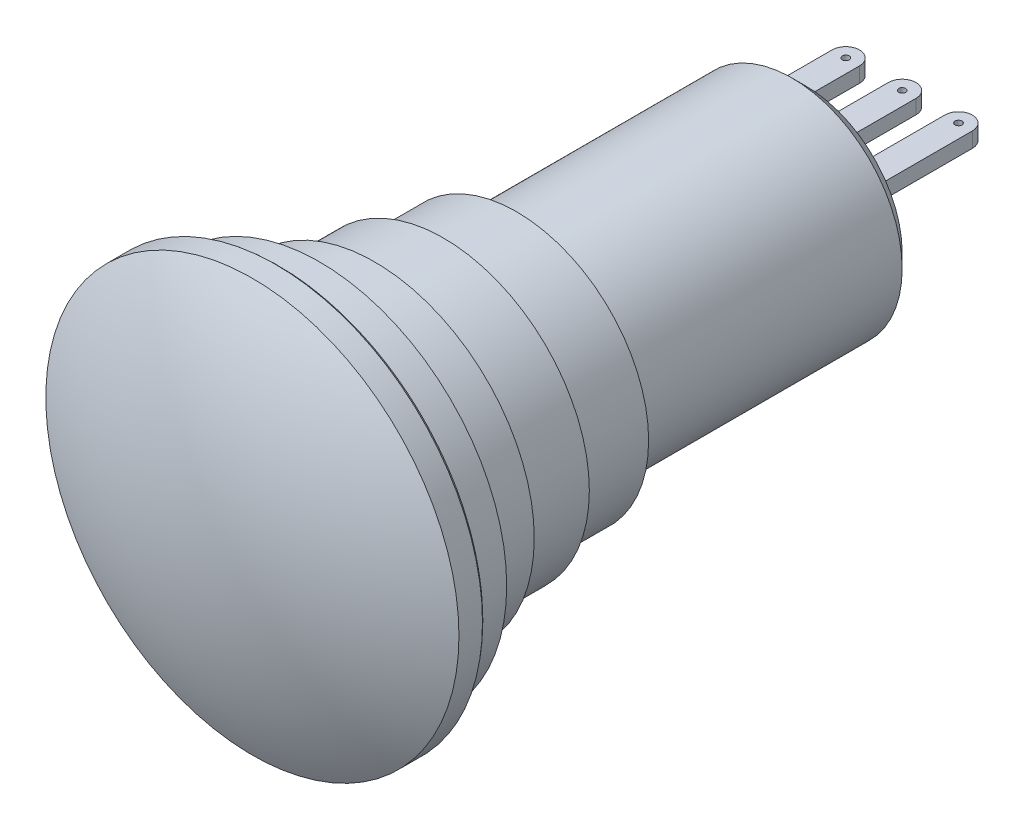
ISO-10303-21;
HEADER;
FILE_DESCRIPTION(('STEP AP214'),'2;1');
FILE_NAME('part.step','',(''),(''),'','','');
FILE_SCHEMA(('AUTOMOTIVE_DESIGN { 1 0 10303 214 1 1 1 1 }'));
ENDSEC;
DATA;
#1=APPLICATION_CONTEXT('core data for automotive mechanical design processes');
#2=APPLICATION_PROTOCOL_DEFINITION('international standard','automotive_design',2000,#1);
#3=PRODUCT_CONTEXT('',#1,'mechanical');
#4=PRODUCT('Part','Part','',(#3));
#5=PRODUCT_RELATED_PRODUCT_CATEGORY('part','',(#4));
#6=PRODUCT_DEFINITION_FORMATION('','',#4);
#7=PRODUCT_DEFINITION_CONTEXT('part definition',#1,'design');
#8=PRODUCT_DEFINITION('design','',#6,#7);
#9=PRODUCT_DEFINITION_SHAPE('','',#8);
#10=(LENGTH_UNIT() NAMED_UNIT(*) SI_UNIT(.MILLI.,.METRE.));
#11=(NAMED_UNIT(*) PLANE_ANGLE_UNIT() SI_UNIT($,.RADIAN.));
#12=(NAMED_UNIT(*) SI_UNIT($,.STERADIAN.) SOLID_ANGLE_UNIT());
#13=UNCERTAINTY_MEASURE_WITH_UNIT(LENGTH_MEASURE(1.E-05),#10,'distance_accuracy_value','');
#14=(GEOMETRIC_REPRESENTATION_CONTEXT(3) GLOBAL_UNCERTAINTY_ASSIGNED_CONTEXT((#13)) GLOBAL_UNIT_ASSIGNED_CONTEXT((#10,
#11,#12)) REPRESENTATION_CONTEXT('',''));
#15=CARTESIAN_POINT('',(0.,0.,0.));
#16=DIRECTION('',(0.,0.,1.));
#17=DIRECTION('',(1.,0.,0.));
#18=AXIS2_PLACEMENT_3D('',#15,#16,#17);
#19=CARTESIAN_POINT('',(0.,5.18367058079445,-39.5));
#20=DIRECTION('',(0.,-1.,0.));
#21=DIRECTION('',(1.,0.,0.));
#22=AXIS2_PLACEMENT_3D('',#19,#20,#21);
#23=CYLINDRICAL_SURFACE('',#22,0.25);
#24=CARTESIAN_POINT('',(0.,3.21505442393994,-39.5));
#25=DIRECTION('',(0.,1.,0.));
#26=DIRECTION('',(-1.,0.,0.));
#27=AXIS2_PLACEMENT_3D('',#24,#25,#26);
#28=CIRCLE('',#27,0.25);
#29=CARTESIAN_POINT('',(-0.24999999999999,3.21505442393994,-39.5));
#30=VERTEX_POINT('',#29);
#31=EDGE_CURVE('E352',#30,#30,#28,.F.);
#32=ORIENTED_EDGE('',*,*,#31,.F.);
#33=EDGE_LOOP('',(#32));
#34=FACE_BOUND('',#33,.T.);
#35=CARTESIAN_POINT('',(0.,2.17665175285374,-39.5));
#36=DIRECTION('',(0.,-1.,0.));
#37=DIRECTION('',(1.,0.,0.));
#38=AXIS2_PLACEMENT_3D('',#35,#36,#37);
#39=CIRCLE('',#38,0.25);
#40=CARTESIAN_POINT('',(0.25000000000001,2.17665175285374,-39.5));
#41=VERTEX_POINT('',#40);
#42=EDGE_CURVE('E11',#41,#41,#39,.T.);
#43=ORIENTED_EDGE('',*,*,#42,.T.);
#44=EDGE_LOOP('',(#43));
#45=FACE_BOUND('',#44,.T.);
#46=ADVANCED_FACE('F18',(#34,#45),#23,.F.);
#47=CARTESIAN_POINT('',(0.,2.17665175285374,-40.5));
#48=DIRECTION('',(0.,-1.,0.));
#49=DIRECTION('',(1.,0.,0.));
#50=AXIS2_PLACEMENT_3D('',#47,#48,#49);
#51=PLANE('',#50);
#52=ORIENTED_EDGE('',*,*,#42,.F.);
#53=EDGE_LOOP('',(#52));
#54=FACE_BOUND('',#53,.T.);
#55=CARTESIAN_POINT('',(0.,2.17665175285374,-39.5));
#56=DIRECTION('',(0.,-1.,0.));
#57=DIRECTION('',(1.,0.,0.));
#58=AXIS2_PLACEMENT_3D('',#55,#56,#57);
#59=CIRCLE('',#58,1.);
#60=CARTESIAN_POINT('',(-1.,2.17665175285374,-39.5));
#61=VERTEX_POINT('',#60);
#62=CARTESIAN_POINT('',(1.,2.17665175285374,-39.5));
#63=VERTEX_POINT('',#62);
#64=EDGE_CURVE('E421',#61,#63,#59,.T.);
#65=ORIENTED_EDGE('',*,*,#64,.T.);
#66=DIRECTION('',(0.,0.,1.));
#67=VECTOR('',#66,1.);
#68=CARTESIAN_POINT('',(1.,2.17665175285374,-40.5));
#69=LINE('',#68,#67);
#70=CARTESIAN_POINT('',(1.,2.17665175285374,-32.5));
#71=VERTEX_POINT('',#70);
#72=EDGE_CURVE('E157',#63,#71,#69,.T.);
#73=ORIENTED_EDGE('',*,*,#72,.T.);
#74=DIRECTION('',(1.,0.,0.));
#75=VECTOR('',#74,1.);
#76=CARTESIAN_POINT('',(0.,2.17665175285374,-32.5));
#77=LINE('',#76,#75);
#78=CARTESIAN_POINT('',(-1.,2.17665175285374,-32.5));
#79=VERTEX_POINT('',#78);
#80=EDGE_CURVE('E124',#79,#71,#77,.T.);
#81=ORIENTED_EDGE('',*,*,#80,.F.);
#82=DIRECTION('',(0.,0.,1.));
#83=VECTOR('',#82,1.);
#84=CARTESIAN_POINT('',(-1.,2.17665175285374,-40.5));
#85=LINE('',#84,#83);
#86=EDGE_CURVE('E148',#61,#79,#85,.T.);
#87=ORIENTED_EDGE('',*,*,#86,.F.);
#88=EDGE_LOOP('',(#65,#73,#81,#87));
#89=FACE_BOUND('',#88,.T.);
#90=ADVANCED_FACE('F229',(#54,#89),#51,.T.);
#91=CARTESIAN_POINT('',(-1.,3.21505442393994,-40.5));
#92=DIRECTION('',(0.,1.,0.));
#93=DIRECTION('',(-1.,0.,0.));
#94=AXIS2_PLACEMENT_3D('',#91,#92,#93);
#95=PLANE('',#94);
#96=ORIENTED_EDGE('',*,*,#31,.T.);
#97=EDGE_LOOP('',(#96));
#98=FACE_BOUND('',#97,.T.);
#99=DIRECTION('',(0.,0.,1.));
#100=VECTOR('',#99,1.);
#101=CARTESIAN_POINT('',(1.,3.21505442393994,-40.5));
#102=LINE('',#101,#100);
#103=CARTESIAN_POINT('',(1.,3.21505442393994,-39.5));
#104=VERTEX_POINT('',#103);
#105=CARTESIAN_POINT('',(1.,3.21505442393994,-32.5));
#106=VERTEX_POINT('',#105);
#107=EDGE_CURVE('E153',#104,#106,#102,.T.);
#108=ORIENTED_EDGE('',*,*,#107,.F.);
#109=CARTESIAN_POINT('',(0.,3.21505442393994,-39.5));
#110=DIRECTION('',(0.,1.,0.));
#111=DIRECTION('',(-1.,0.,0.));
#112=AXIS2_PLACEMENT_3D('',#109,#110,#111);
#113=CIRCLE('',#112,1.);
#114=CARTESIAN_POINT('',(-1.,3.21505442393994,-39.5));
#115=VERTEX_POINT('',#114);
#116=EDGE_CURVE('E399',#104,#115,#113,.T.);
#117=ORIENTED_EDGE('',*,*,#116,.T.);
#118=DIRECTION('',(0.,0.,1.));
#119=VECTOR('',#118,1.);
#120=CARTESIAN_POINT('',(-1.,3.21505442393994,-40.5));
#121=LINE('',#120,#119);
#122=CARTESIAN_POINT('',(-1.,3.21505442393994,-32.5));
#123=VERTEX_POINT('',#122);
#124=EDGE_CURVE('E85',#115,#123,#121,.T.);
#125=ORIENTED_EDGE('',*,*,#124,.T.);
#126=DIRECTION('',(-1.,0.,0.));
#127=VECTOR('',#126,1.);
#128=CARTESIAN_POINT('',(-1.,3.21505442393994,-32.5));
#129=LINE('',#128,#127);
#130=EDGE_CURVE('E140',#106,#123,#129,.T.);
#131=ORIENTED_EDGE('',*,*,#130,.F.);
#132=EDGE_LOOP('',(#108,#117,#125,#131));
#133=FACE_BOUND('',#132,.T.);
#134=ADVANCED_FACE('F234',(#98,#133),#95,.T.);
#135=CARTESIAN_POINT('',(-1.,2.17665175285374,-40.5));
#136=DIRECTION('',(-1.,0.,0.));
#137=DIRECTION('',(0.,-1.,0.));
#138=AXIS2_PLACEMENT_3D('',#135,#136,#137);
#139=PLANE('',#138);
#140=ORIENTED_EDGE('',*,*,#124,.F.);
#141=DIRECTION('',(0.,-1.,0.));
#142=VECTOR('',#141,1.);
#143=CARTESIAN_POINT('',(-1.,4.05264489286049,-39.5));
#144=LINE('',#143,#142);
#145=EDGE_CURVE('E36',#115,#61,#144,.T.);
#146=ORIENTED_EDGE('',*,*,#145,.T.);
#147=ORIENTED_EDGE('',*,*,#86,.T.);
#148=DIRECTION('',(0.,-1.,0.));
#149=VECTOR('',#148,1.);
#150=CARTESIAN_POINT('',(-1.,2.17665175285374,-32.5));
#151=LINE('',#150,#149);
#152=EDGE_CURVE('E144',#123,#79,#151,.T.);
#153=ORIENTED_EDGE('',*,*,#152,.F.);
#154=EDGE_LOOP('',(#140,#146,#147,#153));
#155=FACE_BOUND('',#154,.T.);
#156=ADVANCED_FACE('F272',(#155),#139,.T.);
#157=CARTESIAN_POINT('',(3.09398500474836,2.11505442393994,-40.5));
#158=DIRECTION('',(0.,-1.,0.));
#159=DIRECTION('',(1.,0.,0.));
#160=AXIS2_PLACEMENT_3D('',#157,#158,#159);
#161=PLANE('',#160);
#162=CARTESIAN_POINT('',(4.09398500474836,2.11505442393994,-39.5));
#163=DIRECTION('',(0.,1.,0.));
#164=DIRECTION('',(-1.,0.,0.));
#165=AXIS2_PLACEMENT_3D('',#162,#163,#164);
#166=CIRCLE('',#165,0.25);
#167=CARTESIAN_POINT('',(3.84398500474836,2.11505442393994,-39.5));
#168=VERTEX_POINT('',#167);
#169=EDGE_CURVE('E351',#168,#168,#166,.T.);
#170=ORIENTED_EDGE('',*,*,#169,.T.);
#171=EDGE_LOOP('',(#170));
#172=FACE_BOUND('',#171,.T.);
#173=DIRECTION('',(0.,0.,1.));
#174=VECTOR('',#173,1.);
#175=CARTESIAN_POINT('',(3.09398500474836,2.11505442393994,-40.5));
#176=LINE('',#175,#174);
#177=CARTESIAN_POINT('',(3.09398500474836,2.11505442393994,-39.5));
#178=VERTEX_POINT('',#177);
#179=CARTESIAN_POINT('',(3.09398500474836,2.11505442393994,-32.5));
#180=VERTEX_POINT('',#179);
#181=EDGE_CURVE('E361',#178,#180,#176,.T.);
#182=ORIENTED_EDGE('',*,*,#181,.F.);
#183=CARTESIAN_POINT('',(4.09398500474836,2.11505442393994,-39.5));
#184=DIRECTION('',(0.,1.,0.));
#185=DIRECTION('',(-1.,0.,0.));
#186=AXIS2_PLACEMENT_3D('',#183,#184,#185);
#187=CIRCLE('',#186,1.);
#188=CARTESIAN_POINT('',(5.09398500474836,2.11505442393994,-39.5));
#189=VERTEX_POINT('',#188);
#190=EDGE_CURVE('E350',#189,#178,#187,.T.);
#191=ORIENTED_EDGE('',*,*,#190,.F.);
#192=DIRECTION('',(0.,0.,1.));
#193=VECTOR('',#192,1.);
#194=CARTESIAN_POINT('',(5.09398500474836,2.11505442393994,-40.5));
#195=LINE('',#194,#193);
#196=CARTESIAN_POINT('',(5.09398500474836,2.11505442393994,-32.5));
#197=VERTEX_POINT('',#196);
#198=EDGE_CURVE('E370',#189,#197,#195,.T.);
#199=ORIENTED_EDGE('',*,*,#198,.T.);
#200=DIRECTION('',(1.,0.,0.));
#201=VECTOR('',#200,1.);
#202=CARTESIAN_POINT('',(3.09398500474836,2.11505442393994,-32.5));
#203=LINE('',#202,#201);
#204=EDGE_CURVE('E117',#180,#197,#203,.T.);
#205=ORIENTED_EDGE('',*,*,#204,.F.);
#206=EDGE_LOOP('',(#182,#191,#199,#205));
#207=FACE_BOUND('',#206,.T.);
#208=ADVANCED_FACE('F20',(#172,#207),#161,.T.);
#209=CARTESIAN_POINT('',(5.09398500474836,3.21505442393994,-40.5));
#210=DIRECTION('',(0.,1.,0.));
#211=DIRECTION('',(-1.,0.,0.));
#212=AXIS2_PLACEMENT_3D('',#209,#210,#211);
#213=PLANE('',#212);
#214=CARTESIAN_POINT('',(4.09398500474836,3.21505442393994,-39.5));
#215=DIRECTION('',(0.,1.,0.));
#216=DIRECTION('',(-1.,0.,0.));
#217=AXIS2_PLACEMENT_3D('',#214,#215,#216);
#218=CIRCLE('',#217,0.25);
#219=CARTESIAN_POINT('',(3.84398500474836,3.21505442393994,-39.5));
#220=VERTEX_POINT('',#219);
#221=EDGE_CURVE('E346',#220,#220,#218,.F.);
#222=ORIENTED_EDGE('',*,*,#221,.T.);
#223=EDGE_LOOP('',(#222));
#224=FACE_BOUND('',#223,.T.);
#225=CARTESIAN_POINT('',(4.09398500474836,3.21505442393994,-39.5));
#226=DIRECTION('',(0.,1.,0.));
#227=DIRECTION('',(-1.,0.,0.));
#228=AXIS2_PLACEMENT_3D('',#225,#226,#227);
#229=CIRCLE('',#228,1.);
#230=CARTESIAN_POINT('',(3.09398500474836,3.21505442393994,-39.5));
#231=VERTEX_POINT('',#230);
#232=CARTESIAN_POINT('',(5.09398500474836,3.21505442393994,-39.5));
#233=VERTEX_POINT('',#232);
#234=EDGE_CURVE('E381',#231,#233,#229,.F.);
#235=ORIENTED_EDGE('',*,*,#234,.F.);
#236=DIRECTION('',(0.,0.,1.));
#237=VECTOR('',#236,1.);
#238=CARTESIAN_POINT('',(3.09398500474836,3.21505442393994,-40.5));
#239=LINE('',#238,#237);
#240=CARTESIAN_POINT('',(3.09398500474836,3.21505442393994,-32.5));
#241=VERTEX_POINT('',#240);
#242=EDGE_CURVE('E364',#231,#241,#239,.T.);
#243=ORIENTED_EDGE('',*,*,#242,.T.);
#244=DIRECTION('',(-1.,0.,0.));
#245=VECTOR('',#244,1.);
#246=CARTESIAN_POINT('',(5.09398500474836,3.21505442393994,-32.5));
#247=LINE('',#246,#245);
#248=CARTESIAN_POINT('',(5.09398500474836,3.21505442393994,-32.5));
#249=VERTEX_POINT('',#248);
#250=EDGE_CURVE('E411',#249,#241,#247,.T.);
#251=ORIENTED_EDGE('',*,*,#250,.F.);
#252=DIRECTION('',(0.,0.,1.));
#253=VECTOR('',#252,1.);
#254=CARTESIAN_POINT('',(5.09398500474836,3.21505442393994,-40.5));
#255=LINE('',#254,#253);
#256=EDGE_CURVE('E373',#233,#249,#255,.T.);
#257=ORIENTED_EDGE('',*,*,#256,.F.);
#258=EDGE_LOOP('',(#235,#243,#251,#257));
#259=FACE_BOUND('',#258,.T.);
#260=ADVANCED_FACE('F260',(#224,#259),#213,.T.);
#261=CARTESIAN_POINT('',(3.09398500474836,3.21505442393994,-40.5));
#262=DIRECTION('',(-1.,0.,0.));
#263=DIRECTION('',(0.,0.,1.));
#264=AXIS2_PLACEMENT_3D('',#261,#262,#263);
#265=PLANE('',#264);
#266=ORIENTED_EDGE('',*,*,#242,.F.);
#267=DIRECTION('',(0.,-1.,0.));
#268=VECTOR('',#267,1.);
#269=CARTESIAN_POINT('',(3.09398500474836,6.31445952989416,-39.5));
#270=LINE('',#269,#268);
#271=EDGE_CURVE('E360',#231,#178,#270,.T.);
#272=ORIENTED_EDGE('',*,*,#271,.T.);
#273=ORIENTED_EDGE('',*,*,#181,.T.);
#274=DIRECTION('',(0.,-1.,0.));
#275=VECTOR('',#274,1.);
#276=CARTESIAN_POINT('',(3.09398500474836,3.21505442393994,-32.5));
#277=LINE('',#276,#275);
#278=EDGE_CURVE('E365',#241,#180,#277,.T.);
#279=ORIENTED_EDGE('',*,*,#278,.F.);
#280=EDGE_LOOP('',(#266,#272,#273,#279));
#281=FACE_BOUND('',#280,.T.);
#282=ADVANCED_FACE('F257',(#281),#265,.T.);
#283=CARTESIAN_POINT('',(-5.09398500474834,3.21505442393994,-40.5));
#284=DIRECTION('',(0.,-1.,0.));
#285=DIRECTION('',(1.,0.,0.));
#286=AXIS2_PLACEMENT_3D('',#283,#284,#285);
#287=PLANE('',#286);
#288=CARTESIAN_POINT('',(-4.09398500474834,3.21505442393994,-39.5));
#289=DIRECTION('',(0.,-1.,0.));
#290=DIRECTION('',(1.,0.,0.));
#291=AXIS2_PLACEMENT_3D('',#288,#289,#290);
#292=CIRCLE('',#291,0.25);
#293=CARTESIAN_POINT('',(-3.84398500474834,3.21505442393994,-39.5));
#294=VERTEX_POINT('',#293);
#295=EDGE_CURVE('E380',#294,#294,#292,.F.);
#296=ORIENTED_EDGE('',*,*,#295,.F.);
#297=EDGE_LOOP('',(#296));
#298=FACE_BOUND('',#297,.T.);
#299=DIRECTION('',(0.,0.,1.));
#300=VECTOR('',#299,1.);
#301=CARTESIAN_POINT('',(-3.09398500474834,3.21505442393994,-40.5));
#302=LINE('',#301,#300);
#303=CARTESIAN_POINT('',(-3.09398500474834,3.21505442393994,-39.5));
#304=VERTEX_POINT('',#303);
#305=CARTESIAN_POINT('',(-3.09398500474834,3.21505442393994,-32.5));
#306=VERTEX_POINT('',#305);
#307=EDGE_CURVE('E115',#304,#306,#302,.T.);
#308=ORIENTED_EDGE('',*,*,#307,.F.);
#309=CARTESIAN_POINT('',(-4.09398500474834,3.21505442393994,-39.5));
#310=DIRECTION('',(0.,-1.,0.));
#311=DIRECTION('',(1.,0.,0.));
#312=AXIS2_PLACEMENT_3D('',#309,#310,#311);
#313=CIRCLE('',#312,1.);
#314=CARTESIAN_POINT('',(-5.09398500474834,3.21505442393994,-39.5));
#315=VERTEX_POINT('',#314);
#316=EDGE_CURVE('E101',#315,#304,#313,.T.);
#317=ORIENTED_EDGE('',*,*,#316,.F.);
#318=DIRECTION('',(0.,0.,1.));
#319=VECTOR('',#318,1.);
#320=CARTESIAN_POINT('',(-5.09398500474834,3.21505442393994,-40.5));
#321=LINE('',#320,#319);
#322=CARTESIAN_POINT('',(-5.09398500474834,3.21505442393994,-32.5));
#323=VERTEX_POINT('',#322);
#324=EDGE_CURVE('E113',#315,#323,#321,.T.);
#325=ORIENTED_EDGE('',*,*,#324,.T.);
#326=DIRECTION('',(1.,0.,0.));
#327=VECTOR('',#326,1.);
#328=CARTESIAN_POINT('',(-5.09398500474834,3.21505442393994,-32.5));
#329=LINE('',#328,#327);
#330=EDGE_CURVE('E427',#323,#306,#329,.T.);
#331=ORIENTED_EDGE('',*,*,#330,.T.);
#332=EDGE_LOOP('',(#308,#317,#325,#331));
#333=FACE_BOUND('',#332,.T.);
#334=ADVANCED_FACE('F111',(#298,#333),#287,.F.);
#335=CARTESIAN_POINT('',(-3.09398500474834,3.21505442393994,-40.5));
#336=DIRECTION('',(-1.,0.,0.));
#337=DIRECTION('',(0.,-1.,0.));
#338=AXIS2_PLACEMENT_3D('',#335,#336,#337);
#339=PLANE('',#338);
#340=DIRECTION('',(0.,-1.,0.));
#341=VECTOR('',#340,1.);
#342=CARTESIAN_POINT('',(-3.09398500474834,6.31445952989416,-39.5));
#343=LINE('',#342,#341);
#344=CARTESIAN_POINT('',(-3.09398500474834,2.11505442393993,-39.5));
#345=VERTEX_POINT('',#344);
#346=EDGE_CURVE('E383',#304,#345,#343,.T.);
#347=ORIENTED_EDGE('',*,*,#346,.F.);
#348=ORIENTED_EDGE('',*,*,#307,.T.);
#349=DIRECTION('',(0.,-1.,0.));
#350=VECTOR('',#349,1.);
#351=CARTESIAN_POINT('',(-3.09398500474834,3.21505442393994,-32.5));
#352=LINE('',#351,#350);
#353=CARTESIAN_POINT('',(-3.09398500474834,2.11505442393993,-32.5));
#354=VERTEX_POINT('',#353);
#355=EDGE_CURVE('E389',#306,#354,#352,.T.);
#356=ORIENTED_EDGE('',*,*,#355,.T.);
#357=DIRECTION('',(0.,0.,1.));
#358=VECTOR('',#357,1.);
#359=CARTESIAN_POINT('',(-3.09398500474834,2.11505442393993,-40.5));
#360=LINE('',#359,#358);
#361=EDGE_CURVE('E75',#345,#354,#360,.T.);
#362=ORIENTED_EDGE('',*,*,#361,.F.);
#363=EDGE_LOOP('',(#347,#348,#356,#362));
#364=FACE_BOUND('',#363,.T.);
#365=ADVANCED_FACE('F265',(#364),#339,.F.);
#366=CARTESIAN_POINT('',(0.,0.,-32.5));
#367=DIRECTION('',(0.,0.,1.));
#368=DIRECTION('',(1.,0.,0.));
#369=AXIS2_PLACEMENT_3D('',#366,#367,#368);
#370=PLANE('',#369);
#371=ORIENTED_EDGE('',*,*,#278,.T.);
#372=ORIENTED_EDGE('',*,*,#204,.T.);
#373=DIRECTION('',(0.,1.,0.));
#374=VECTOR('',#373,1.);
#375=CARTESIAN_POINT('',(5.09398500474836,2.21505442393994,-32.5));
#376=LINE('',#375,#374);
#377=EDGE_CURVE('E369',#197,#249,#376,.T.);
#378=ORIENTED_EDGE('',*,*,#377,.T.);
#379=ORIENTED_EDGE('',*,*,#250,.T.);
#380=EDGE_LOOP('',(#371,#372,#378,#379));
#381=FACE_BOUND('',#380,.T.);
#382=CARTESIAN_POINT('',(0.,0.,-32.5));
#383=DIRECTION('',(0.,0.,1.));
#384=DIRECTION('',(1.,0.,0.));
#385=AXIS2_PLACEMENT_3D('',#382,#383,#384);
#386=CIRCLE('',#385,7.);
#387=CARTESIAN_POINT('',(7.00000000000001,0.,-32.5));
#388=VERTEX_POINT('',#387);
#389=EDGE_CURVE('E28',#388,#388,#386,.F.);
#390=ORIENTED_EDGE('',*,*,#389,.T.);
#391=EDGE_LOOP('',(#390));
#392=FACE_BOUND('',#391,.T.);
#393=ORIENTED_EDGE('',*,*,#130,.T.);
#394=ORIENTED_EDGE('',*,*,#152,.T.);
#395=ORIENTED_EDGE('',*,*,#80,.T.);
#396=DIRECTION('',(0.,1.,0.));
#397=VECTOR('',#396,1.);
#398=CARTESIAN_POINT('',(1.,2.17665175285374,-32.5));
#399=LINE('',#398,#397);
#400=EDGE_CURVE('E131',#71,#106,#399,.T.);
#401=ORIENTED_EDGE('',*,*,#400,.T.);
#402=EDGE_LOOP('',(#393,#394,#395,#401));
#403=FACE_BOUND('',#402,.T.);
#404=DIRECTION('',(0.,1.,0.));
#405=VECTOR('',#404,1.);
#406=CARTESIAN_POINT('',(-5.09398500474834,2.21505442393994,-32.5));
#407=LINE('',#406,#405);
#408=CARTESIAN_POINT('',(-5.09398500474834,2.11505442393993,-32.5));
#409=VERTEX_POINT('',#408);
#410=EDGE_CURVE('E122',#409,#323,#407,.T.);
#411=ORIENTED_EDGE('',*,*,#410,.F.);
#412=DIRECTION('',(-1.,0.,0.));
#413=VECTOR('',#412,1.);
#414=CARTESIAN_POINT('',(-3.09398500474834,2.11505442393993,-32.5));
#415=LINE('',#414,#413);
#416=EDGE_CURVE('E387',#354,#409,#415,.T.);
#417=ORIENTED_EDGE('',*,*,#416,.F.);
#418=ORIENTED_EDGE('',*,*,#355,.F.);
#419=ORIENTED_EDGE('',*,*,#330,.F.);
#420=EDGE_LOOP('',(#411,#417,#418,#419));
#421=FACE_BOUND('',#420,.T.);
#422=ADVANCED_FACE('F205',(#381,#392,#403,#421),#370,.F.);
#423=CARTESIAN_POINT('',(0.,0.,-13.1462663338588));
#424=DIRECTION('',(0.,0.,1.));
#425=DIRECTION('',(1.,0.,0.));
#426=AXIS2_PLACEMENT_3D('',#423,#424,#425);
#427=CYLINDRICAL_SURFACE('',#426,10.5890846391691);
#428=CARTESIAN_POINT('',(0.,0.,-6.19331655071755));
#429=DIRECTION('',(0.,0.,1.));
#430=DIRECTION('',(1.,0.,0.));
#431=AXIS2_PLACEMENT_3D('',#428,#429,#430);
#432=CIRCLE('',#431,10.5890846391691);
#433=CARTESIAN_POINT('',(10.5890846391691,0.,-6.19331655071755));
#434=VERTEX_POINT('',#433);
#435=EDGE_CURVE('E336',#434,#434,#432,.T.);
#436=ORIENTED_EDGE('',*,*,#435,.T.);
#437=EDGE_LOOP('',(#436));
#438=FACE_BOUND('',#437,.T.);
#439=CARTESIAN_POINT('',(0.,0.,-1.19331655071755));
#440=DIRECTION('',(0.,0.,1.));
#441=DIRECTION('',(1.,0.,0.));
#442=AXIS2_PLACEMENT_3D('',#439,#440,#441);
#443=CIRCLE('',#442,10.5890846391691);
#444=CARTESIAN_POINT('',(10.5890846391691,0.,-1.19331655071755));
#445=VERTEX_POINT('',#444);
#446=EDGE_CURVE('E165',#445,#445,#443,.T.);
#447=ORIENTED_EDGE('',*,*,#446,.F.);
#448=EDGE_LOOP('',(#447));
#449=FACE_BOUND('',#448,.T.);
#450=ADVANCED_FACE('F201',(#438,#449),#427,.T.);
#451=CARTESIAN_POINT('',(10.5890846391691,0.,-6.19331655071755));
#452=DIRECTION('',(0.,0.,-1.));
#453=DIRECTION('',(-1.,0.,0.));
#454=AXIS2_PLACEMENT_3D('',#451,#452,#453);
#455=PLANE('',#454);
#456=CARTESIAN_POINT('',(0.,0.,-6.19331655071756));
#457=DIRECTION('',(0.,0.,1.));
#458=DIRECTION('',(1.,0.,0.));
#459=AXIS2_PLACEMENT_3D('',#456,#457,#458);
#460=CIRCLE('',#459,9.58908463916915);
#461=CARTESIAN_POINT('',(9.58908463916915,0.,-6.19331655071756));
#462=VERTEX_POINT('',#461);
#463=EDGE_CURVE('E332',#462,#462,#460,.T.);
#464=ORIENTED_EDGE('',*,*,#463,.T.);
#465=EDGE_LOOP('',(#464));
#466=FACE_BOUND('',#465,.T.);
#467=ORIENTED_EDGE('',*,*,#435,.F.);
#468=EDGE_LOOP('',(#467));
#469=FACE_BOUND('',#468,.T.);
#470=ADVANCED_FACE('F197',(#466,#469),#455,.T.);
#471=CARTESIAN_POINT('',(0.,0.,-13.1462663338588));
#472=DIRECTION('',(0.,0.,1.));
#473=DIRECTION('',(1.,0.,0.));
#474=AXIS2_PLACEMENT_3D('',#471,#472,#473);
#475=CYLINDRICAL_SURFACE('',#474,9.58908463916915);
#476=CARTESIAN_POINT('',(0.,0.,-11.5));
#477=DIRECTION('',(0.,0.,1.));
#478=DIRECTION('',(1.,0.,0.));
#479=AXIS2_PLACEMENT_3D('',#476,#477,#478);
#480=CIRCLE('',#479,9.58908463916915);
#481=CARTESIAN_POINT('',(9.58908463916915,0.,-11.5));
#482=VERTEX_POINT('',#481);
#483=EDGE_CURVE('E328',#482,#482,#480,.T.);
#484=ORIENTED_EDGE('',*,*,#483,.T.);
#485=EDGE_LOOP('',(#484));
#486=FACE_BOUND('',#485,.T.);
#487=ORIENTED_EDGE('',*,*,#463,.F.);
#488=EDGE_LOOP('',(#487));
#489=FACE_BOUND('',#488,.T.);
#490=ADVANCED_FACE('F193',(#486,#489),#475,.T.);
#491=CARTESIAN_POINT('',(9.58908463916915,0.,-11.5));
#492=DIRECTION('',(0.,0.,-1.));
#493=DIRECTION('',(-1.,0.,0.));
#494=AXIS2_PLACEMENT_3D('',#491,#492,#493);
#495=PLANE('',#494);
#496=CARTESIAN_POINT('',(0.,0.,-11.5));
#497=DIRECTION('',(0.,0.,1.));
#498=DIRECTION('',(1.,0.,0.));
#499=AXIS2_PLACEMENT_3D('',#496,#497,#498);
#500=CIRCLE('',#499,8.);
#501=CARTESIAN_POINT('',(8.,0.,-11.5));
#502=VERTEX_POINT('',#501);
#503=EDGE_CURVE('E161',#502,#502,#500,.T.);
#504=ORIENTED_EDGE('',*,*,#503,.T.);
#505=EDGE_LOOP('',(#504));
#506=FACE_BOUND('',#505,.T.);
#507=ORIENTED_EDGE('',*,*,#483,.F.);
#508=EDGE_LOOP('',(#507));
#509=FACE_BOUND('',#508,.T.);
#510=ADVANCED_FACE('F189',(#506,#509),#495,.T.);
#511=CARTESIAN_POINT('',(0.,0.,-19.8914411778848));
#512=DIRECTION('',(0.,0.,1.));
#513=DIRECTION('',(1.,0.,0.));
#514=AXIS2_PLACEMENT_3D('',#511,#512,#513);
#515=SPHERICAL_SURFACE('',#514,31.3914411778849);
#516=CARTESIAN_POINT('',(0.,0.,7.68431954098934));
#517=DIRECTION('',(0.,0.,1.));
#518=DIRECTION('',(1.,0.,0.));
#519=AXIS2_PLACEMENT_3D('',#516,#517,#518);
#520=CIRCLE('',#519,15.);
#521=CARTESIAN_POINT('',(15.,0.,7.68431954098934));
#522=VERTEX_POINT('',#521);
#523=EDGE_CURVE('E324',#522,#522,#520,.T.);
#524=ORIENTED_EDGE('',*,*,#523,.T.);
#525=EDGE_LOOP('',(#524));
#526=FACE_BOUND('',#525,.T.);
#527=ADVANCED_FACE('F185',(#526),#515,.T.);
#528=CARTESIAN_POINT('',(0.,0.,-13.1462663338588));
#529=DIRECTION('',(0.,0.,1.));
#530=DIRECTION('',(1.,0.,0.));
#531=AXIS2_PLACEMENT_3D('',#528,#529,#530);
#532=CYLINDRICAL_SURFACE('',#531,15.);
#533=CARTESIAN_POINT('',(0.,0.,5.9750311918377));
#534=DIRECTION('',(0.,0.,1.));
#535=DIRECTION('',(1.,0.,0.));
#536=AXIS2_PLACEMENT_3D('',#533,#534,#535);
#537=CIRCLE('',#536,15.);
#538=CARTESIAN_POINT('',(15.,0.,5.9750311918377));
#539=VERTEX_POINT('',#538);
#540=EDGE_CURVE('E315',#539,#539,#537,.T.);
#541=ORIENTED_EDGE('',*,*,#540,.T.);
#542=EDGE_LOOP('',(#541));
#543=FACE_BOUND('',#542,.T.);
#544=ORIENTED_EDGE('',*,*,#523,.F.);
#545=EDGE_LOOP('',(#544));
#546=FACE_BOUND('',#545,.T.);
#547=ADVANCED_FACE('F180',(#543,#546),#532,.T.);
#548=CARTESIAN_POINT('',(15.,0.,5.9750311918377));
#549=CARTESIAN_POINT('',(14.8106362863782,0.,5.67579497001341));
#550=CARTESIAN_POINT('',(14.3403311661015,0.,5.45301238916205));
#551=CARTESIAN_POINT('',(13.5890846391691,0.,5.30668344928245));
#552=B_SPLINE_CURVE_WITH_KNOTS('',3,(#548,#549,#550,#551),.UNSPECIFIED.,.F.,.F.,(4,4),(0.,1.),.UNSPECIFIED.);
#553=CARTESIAN_POINT('',(0.,0.,-13.1462663338588));
#554=DIRECTION('',(0.,0.,1.));
#555=AXIS1_PLACEMENT('',#553,#554);
#556=SURFACE_OF_REVOLUTION('',#552,#555);
#557=CARTESIAN_POINT('',(0.,0.,5.30668344928245));
#558=DIRECTION('',(0.,0.,1.));
#559=DIRECTION('',(1.,0.,0.));
#560=AXIS2_PLACEMENT_3D('',#557,#558,#559);
#561=CIRCLE('',#560,13.5890846391692);
#562=CARTESIAN_POINT('',(13.5890846391692,0.,5.30668344928245));
#563=VERTEX_POINT('',#562);
#564=EDGE_CURVE('E309',#563,#563,#561,.T.);
#565=ORIENTED_EDGE('',*,*,#564,.T.);
#566=EDGE_LOOP('',(#565));
#567=FACE_BOUND('',#566,.T.);
#568=ORIENTED_EDGE('',*,*,#540,.F.);
#569=EDGE_LOOP('',(#568));
#570=FACE_BOUND('',#569,.T.);
#571=ADVANCED_FACE('F175',(#567,#570),#556,.F.);
#572=CARTESIAN_POINT('',(0.,0.,-13.1462663338588));
#573=DIRECTION('',(0.,0.,1.));
#574=DIRECTION('',(1.,0.,0.));
#575=AXIS2_PLACEMENT_3D('',#572,#573,#574);
#576=CYLINDRICAL_SURFACE('',#575,13.5890846391691);
#577=CARTESIAN_POINT('',(0.,0.,2.80668344928245));
#578=DIRECTION('',(0.,0.,1.));
#579=DIRECTION('',(1.,0.,0.));
#580=AXIS2_PLACEMENT_3D('',#577,#578,#579);
#581=CIRCLE('',#580,13.5890846391691);
#582=CARTESIAN_POINT('',(13.5890846391691,0.,2.80668344928245));
#583=VERTEX_POINT('',#582);
#584=EDGE_CURVE('E307',#583,#583,#581,.T.);
#585=ORIENTED_EDGE('',*,*,#584,.T.);
#586=EDGE_LOOP('',(#585));
#587=FACE_BOUND('',#586,.T.);
#588=ORIENTED_EDGE('',*,*,#564,.F.);
#589=EDGE_LOOP('',(#588));
#590=FACE_BOUND('',#589,.T.);
#591=ADVANCED_FACE('F179',(#587,#590),#576,.T.);
#592=CARTESIAN_POINT('',(13.5890846391691,0.,2.80668344928245));
#593=DIRECTION('',(0.,0.,-1.));
#594=DIRECTION('',(-1.,0.,0.));
#595=AXIS2_PLACEMENT_3D('',#592,#593,#594);
#596=PLANE('',#595);
#597=CARTESIAN_POINT('',(0.,0.,2.80668344928245));
#598=DIRECTION('',(0.,0.,1.));
#599=DIRECTION('',(1.,0.,0.));
#600=AXIS2_PLACEMENT_3D('',#597,#598,#599);
#601=CIRCLE('',#600,11.5890846391691);
#602=CARTESIAN_POINT('',(11.5890846391691,0.,2.80668344928245));
#603=VERTEX_POINT('',#602);
#604=EDGE_CURVE('E304',#603,#603,#601,.T.);
#605=ORIENTED_EDGE('',*,*,#604,.T.);
#606=EDGE_LOOP('',(#605));
#607=FACE_BOUND('',#606,.T.);
#608=ORIENTED_EDGE('',*,*,#584,.F.);
#609=EDGE_LOOP('',(#608));
#610=FACE_BOUND('',#609,.T.);
#611=ADVANCED_FACE('F294',(#607,#610),#596,.T.);
#612=CARTESIAN_POINT('',(0.,0.,-13.1462663338588));
#613=DIRECTION('',(0.,0.,1.));
#614=DIRECTION('',(1.,0.,0.));
#615=AXIS2_PLACEMENT_3D('',#612,#613,#614);
#616=CYLINDRICAL_SURFACE('',#615,11.5890846391691);
#617=CARTESIAN_POINT('',(0.,0.,-1.19331655071755));
#618=DIRECTION('',(0.,0.,1.));
#619=DIRECTION('',(1.,0.,0.));
#620=AXIS2_PLACEMENT_3D('',#617,#618,#619);
#621=CIRCLE('',#620,11.5890846391691);
#622=CARTESIAN_POINT('',(11.5890846391691,0.,-1.19331655071755));
#623=VERTEX_POINT('',#622);
#624=EDGE_CURVE('E318',#623,#623,#621,.T.);
#625=ORIENTED_EDGE('',*,*,#624,.T.);
#626=EDGE_LOOP('',(#625));
#627=FACE_BOUND('',#626,.T.);
#628=ORIENTED_EDGE('',*,*,#604,.F.);
#629=EDGE_LOOP('',(#628));
#630=FACE_BOUND('',#629,.T.);
#631=ADVANCED_FACE('F291',(#627,#630),#616,.T.);
#632=CARTESIAN_POINT('',(11.5890846391691,0.,-1.19331655071755));
#633=DIRECTION('',(0.,0.,-1.));
#634=DIRECTION('',(-1.,0.,0.));
#635=AXIS2_PLACEMENT_3D('',#632,#633,#634);
#636=PLANE('',#635);
#637=ORIENTED_EDGE('',*,*,#446,.T.);
#638=EDGE_LOOP('',(#637));
#639=FACE_BOUND('',#638,.T.);
#640=ORIENTED_EDGE('',*,*,#624,.F.);
#641=EDGE_LOOP('',(#640));
#642=FACE_BOUND('',#641,.T.);
#643=ADVANCED_FACE('F287',(#639,#642),#636,.T.);
#644=CARTESIAN_POINT('',(0.,0.,-32.5));
#645=DIRECTION('',(0.,0.,1.));
#646=DIRECTION('',(1.,0.,0.));
#647=AXIS2_PLACEMENT_3D('',#644,#645,#646);
#648=CYLINDRICAL_SURFACE('',#647,8.);
#649=CARTESIAN_POINT('',(0.,0.,-31.5));
#650=DIRECTION('',(0.,0.,1.));
#651=DIRECTION('',(1.,0.,0.));
#652=AXIS2_PLACEMENT_3D('',#649,#650,#651);
#653=CIRCLE('',#652,8.);
#654=CARTESIAN_POINT('',(8.00000000000001,0.,-31.5));
#655=VERTEX_POINT('',#654);
#656=EDGE_CURVE('E340',#655,#655,#653,.T.);
#657=ORIENTED_EDGE('',*,*,#656,.T.);
#658=EDGE_LOOP('',(#657));
#659=FACE_BOUND('',#658,.T.);
#660=ORIENTED_EDGE('',*,*,#503,.F.);
#661=EDGE_LOOP('',(#660));
#662=FACE_BOUND('',#661,.T.);
#663=ADVANCED_FACE('F214',(#659,#662),#648,.T.);
#664=CARTESIAN_POINT('',(0.,0.,-31.5));
#665=DIRECTION('',(0.,0.,1.));
#666=DIRECTION('',(1.,0.,0.));
#667=AXIS2_PLACEMENT_3D('',#664,#665,#666);
#668=CONICAL_SURFACE('',#667,8.,0.785398163397448);
#669=ORIENTED_EDGE('',*,*,#389,.F.);
#670=EDGE_LOOP('',(#669));
#671=FACE_BOUND('',#670,.T.);
#672=ORIENTED_EDGE('',*,*,#656,.F.);
#673=EDGE_LOOP('',(#672));
#674=FACE_BOUND('',#673,.T.);
#675=ADVANCED_FACE('F208',(#671,#674),#668,.T.);
#676=CARTESIAN_POINT('',(1.,2.17665175285374,-40.5));
#677=DIRECTION('',(1.,0.,0.));
#678=DIRECTION('',(0.,0.,-1.));
#679=AXIS2_PLACEMENT_3D('',#676,#677,#678);
#680=PLANE('',#679);
#681=DIRECTION('',(0.,-1.,0.));
#682=VECTOR('',#681,1.);
#683=CARTESIAN_POINT('',(1.,4.05264489286049,-39.5));
#684=LINE('',#683,#682);
#685=EDGE_CURVE('E356',#104,#63,#684,.T.);
#686=ORIENTED_EDGE('',*,*,#685,.F.);
#687=ORIENTED_EDGE('',*,*,#107,.T.);
#688=ORIENTED_EDGE('',*,*,#400,.F.);
#689=ORIENTED_EDGE('',*,*,#72,.F.);
#690=EDGE_LOOP('',(#686,#687,#688,#689));
#691=FACE_BOUND('',#690,.T.);
#692=ADVANCED_FACE('F213',(#691),#680,.T.);
#693=CARTESIAN_POINT('',(-5.09398500474834,2.21505442393994,-40.5));
#694=DIRECTION('',(1.,0.,0.));
#695=DIRECTION('',(0.,1.,0.));
#696=AXIS2_PLACEMENT_3D('',#693,#694,#695);
#697=PLANE('',#696);
#698=ORIENTED_EDGE('',*,*,#324,.F.);
#699=DIRECTION('',(0.,-1.,0.));
#700=VECTOR('',#699,1.);
#701=CARTESIAN_POINT('',(-5.09398500474834,6.31445952989416,-39.5));
#702=LINE('',#701,#700);
#703=CARTESIAN_POINT('',(-5.09398500474834,2.11505442393993,-39.5));
#704=VERTEX_POINT('',#703);
#705=EDGE_CURVE('E97',#315,#704,#702,.T.);
#706=ORIENTED_EDGE('',*,*,#705,.T.);
#707=DIRECTION('',(0.,0.,1.));
#708=VECTOR('',#707,1.);
#709=CARTESIAN_POINT('',(-5.09398500474834,2.11505442393993,-40.5));
#710=LINE('',#709,#708);
#711=EDGE_CURVE('E384',#704,#409,#710,.T.);
#712=ORIENTED_EDGE('',*,*,#711,.T.);
#713=ORIENTED_EDGE('',*,*,#410,.T.);
#714=EDGE_LOOP('',(#698,#706,#712,#713));
#715=FACE_BOUND('',#714,.T.);
#716=ADVANCED_FACE('F120',(#715),#697,.F.);
#717=CARTESIAN_POINT('',(-3.09398500474834,2.11505442393993,-40.5));
#718=DIRECTION('',(0.,1.,0.));
#719=DIRECTION('',(-1.,0.,0.));
#720=AXIS2_PLACEMENT_3D('',#717,#718,#719);
#721=PLANE('',#720);
#722=CARTESIAN_POINT('',(-4.09398500474834,2.11505442393993,-39.5));
#723=DIRECTION('',(0.,1.,0.));
#724=DIRECTION('',(-1.,0.,0.));
#725=AXIS2_PLACEMENT_3D('',#722,#723,#724);
#726=CIRCLE('',#725,0.25);
#727=CARTESIAN_POINT('',(-4.34398500474834,2.11505442393993,-39.5));
#728=VERTEX_POINT('',#727);
#729=EDGE_CURVE('E377',#728,#728,#726,.T.);
#730=ORIENTED_EDGE('',*,*,#729,.T.);
#731=EDGE_LOOP('',(#730));
#732=FACE_BOUND('',#731,.T.);
#733=CARTESIAN_POINT('',(-4.09398500474834,2.11505442393993,-39.5));
#734=DIRECTION('',(0.,-1.,0.));
#735=DIRECTION('',(1.,0.,0.));
#736=AXIS2_PLACEMENT_3D('',#733,#734,#735);
#737=CIRCLE('',#736,1.);
#738=EDGE_CURVE('E103',#704,#345,#737,.T.);
#739=ORIENTED_EDGE('',*,*,#738,.T.);
#740=ORIENTED_EDGE('',*,*,#361,.T.);
#741=ORIENTED_EDGE('',*,*,#416,.T.);
#742=ORIENTED_EDGE('',*,*,#711,.F.);
#743=EDGE_LOOP('',(#739,#740,#741,#742));
#744=FACE_BOUND('',#743,.T.);
#745=ADVANCED_FACE('F216',(#732,#744),#721,.F.);
#746=CARTESIAN_POINT('',(5.09398500474836,2.21505442393994,-40.5));
#747=DIRECTION('',(1.,0.,0.));
#748=DIRECTION('',(0.,1.,0.));
#749=AXIS2_PLACEMENT_3D('',#746,#747,#748);
#750=PLANE('',#749);
#751=DIRECTION('',(0.,-1.,0.));
#752=VECTOR('',#751,1.);
#753=CARTESIAN_POINT('',(5.09398500474836,6.31445952989416,-39.5));
#754=LINE('',#753,#752);
#755=EDGE_CURVE('E376',#233,#189,#754,.T.);
#756=ORIENTED_EDGE('',*,*,#755,.F.);
#757=ORIENTED_EDGE('',*,*,#256,.T.);
#758=ORIENTED_EDGE('',*,*,#377,.F.);
#759=ORIENTED_EDGE('',*,*,#198,.F.);
#760=EDGE_LOOP('',(#756,#757,#758,#759));
#761=FACE_BOUND('',#760,.T.);
#762=ADVANCED_FACE('F218',(#761),#750,.T.);
#763=CARTESIAN_POINT('',(-4.09398500474834,6.31445952989416,-39.5));
#764=DIRECTION('',(0.,-1.,0.));
#765=DIRECTION('',(1.,0.,0.));
#766=AXIS2_PLACEMENT_3D('',#763,#764,#765);
#767=CYLINDRICAL_SURFACE('',#766,1.);
#768=ORIENTED_EDGE('',*,*,#316,.T.);
#769=ORIENTED_EDGE('',*,*,#346,.T.);
#770=ORIENTED_EDGE('',*,*,#738,.F.);
#771=ORIENTED_EDGE('',*,*,#705,.F.);
#772=EDGE_LOOP('',(#768,#769,#770,#771));
#773=FACE_BOUND('',#772,.T.);
#774=ADVANCED_FACE('F99',(#773),#767,.T.);
#775=CARTESIAN_POINT('',(-4.09398500474834,6.31445952989416,-39.5));
#776=DIRECTION('',(0.,-1.,0.));
#777=DIRECTION('',(1.,0.,0.));
#778=AXIS2_PLACEMENT_3D('',#775,#776,#777);
#779=CYLINDRICAL_SURFACE('',#778,0.25);
#780=ORIENTED_EDGE('',*,*,#729,.F.);
#781=EDGE_LOOP('',(#780));
#782=FACE_BOUND('',#781,.T.);
#783=ORIENTED_EDGE('',*,*,#295,.T.);
#784=EDGE_LOOP('',(#783));
#785=FACE_BOUND('',#784,.T.);
#786=ADVANCED_FACE('F250',(#782,#785),#779,.F.);
#787=CARTESIAN_POINT('',(4.09398500474836,6.31445952989416,-39.5));
#788=DIRECTION('',(0.,-1.,0.));
#789=DIRECTION('',(1.,0.,0.));
#790=AXIS2_PLACEMENT_3D('',#787,#788,#789);
#791=CYLINDRICAL_SURFACE('',#790,1.);
#792=ORIENTED_EDGE('',*,*,#234,.T.);
#793=ORIENTED_EDGE('',*,*,#755,.T.);
#794=ORIENTED_EDGE('',*,*,#190,.T.);
#795=ORIENTED_EDGE('',*,*,#271,.F.);
#796=EDGE_LOOP('',(#792,#793,#794,#795));
#797=FACE_BOUND('',#796,.T.);
#798=ADVANCED_FACE('F246',(#797),#791,.T.);
#799=CARTESIAN_POINT('',(4.09398500474836,6.31445952989416,-39.5));
#800=DIRECTION('',(0.,-1.,0.));
#801=DIRECTION('',(1.,0.,0.));
#802=AXIS2_PLACEMENT_3D('',#799,#800,#801);
#803=CYLINDRICAL_SURFACE('',#802,0.25);
#804=ORIENTED_EDGE('',*,*,#221,.F.);
#805=EDGE_LOOP('',(#804));
#806=FACE_BOUND('',#805,.T.);
#807=ORIENTED_EDGE('',*,*,#169,.F.);
#808=EDGE_LOOP('',(#807));
#809=FACE_BOUND('',#808,.T.);
#810=ADVANCED_FACE('F243',(#806,#809),#803,.F.);
#811=CARTESIAN_POINT('',(0.,4.05264489286049,-39.5));
#812=DIRECTION('',(0.,-1.,0.));
#813=DIRECTION('',(1.,0.,0.));
#814=AXIS2_PLACEMENT_3D('',#811,#812,#813);
#815=CYLINDRICAL_SURFACE('',#814,1.);
#816=ORIENTED_EDGE('',*,*,#116,.F.);
#817=ORIENTED_EDGE('',*,*,#685,.T.);
#818=ORIENTED_EDGE('',*,*,#64,.F.);
#819=ORIENTED_EDGE('',*,*,#145,.F.);
#820=EDGE_LOOP('',(#816,#817,#818,#819));
#821=FACE_BOUND('',#820,.T.);
#822=ADVANCED_FACE('F240',(#821),#815,.T.);
#823=CLOSED_SHELL('',(#46,#90,#134,#156,#208,#260,#282,#334,#365,#422,#450,#470,#490,#510,#527,
#547,#571,#591,#611,#631,#643,#663,#675,#692,#716,#745,#762,#774,#786,#798,#810,#822));
#824=MANIFOLD_SOLID_BREP('B1',#823);
#825=ADVANCED_BREP_SHAPE_REPRESENTATION('',(#18,#824),#14);
#826=SHAPE_DEFINITION_REPRESENTATION(#9,#825);
ENDSEC;
END-ISO-10303-21;
